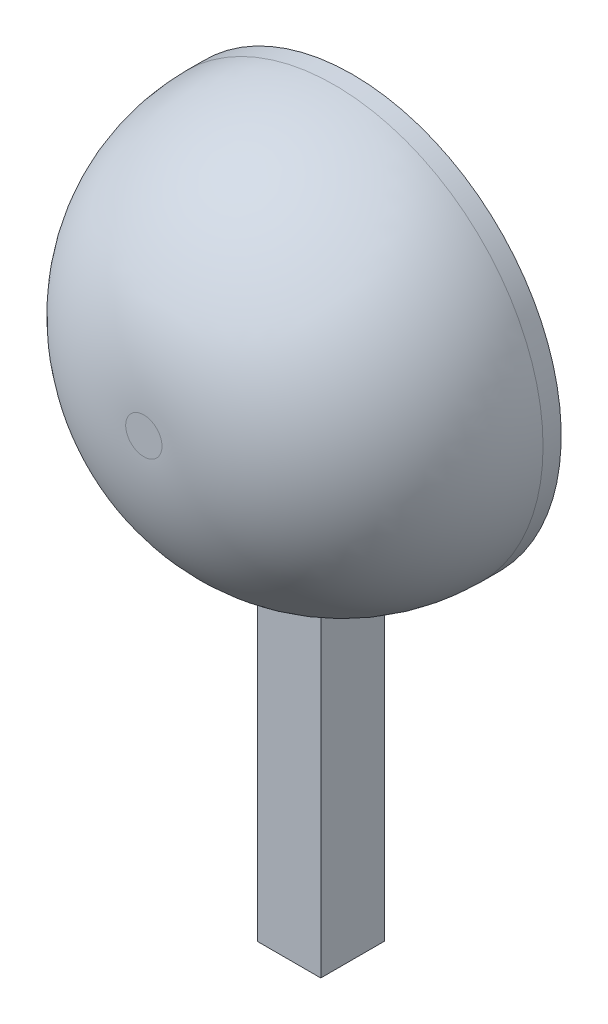
ISO-10303-21;
HEADER;
FILE_DESCRIPTION(('STEP AP214'),'2;1');
FILE_NAME('part.step','',(''),(''),'','','');
FILE_SCHEMA(('AUTOMOTIVE_DESIGN { 1 0 10303 214 1 1 1 1 }'));
ENDSEC;
DATA;
#1=APPLICATION_CONTEXT('core data for automotive mechanical design processes');
#2=APPLICATION_PROTOCOL_DEFINITION('international standard','automotive_design',2000,#1);
#3=PRODUCT_CONTEXT('',#1,'mechanical');
#4=PRODUCT('Part','Part','',(#3));
#5=PRODUCT_RELATED_PRODUCT_CATEGORY('part','',(#4));
#6=PRODUCT_DEFINITION_FORMATION('','',#4);
#7=PRODUCT_DEFINITION_CONTEXT('part definition',#1,'design');
#8=PRODUCT_DEFINITION('design','',#6,#7);
#9=PRODUCT_DEFINITION_SHAPE('','',#8);
#10=(LENGTH_UNIT() NAMED_UNIT(*) SI_UNIT(.MILLI.,.METRE.));
#11=(NAMED_UNIT(*) PLANE_ANGLE_UNIT() SI_UNIT($,.RADIAN.));
#12=(NAMED_UNIT(*) SI_UNIT($,.STERADIAN.) SOLID_ANGLE_UNIT());
#13=UNCERTAINTY_MEASURE_WITH_UNIT(LENGTH_MEASURE(1.E-05),#10,'distance_accuracy_value','');
#14=(GEOMETRIC_REPRESENTATION_CONTEXT(3) GLOBAL_UNCERTAINTY_ASSIGNED_CONTEXT((#13)) GLOBAL_UNIT_ASSIGNED_CONTEXT((#10,
#11,#12)) REPRESENTATION_CONTEXT('',''));
#15=CARTESIAN_POINT('',(0.,0.,0.));
#16=DIRECTION('',(0.,0.,1.));
#17=DIRECTION('',(1.,0.,0.));
#18=AXIS2_PLACEMENT_3D('',#15,#16,#17);
#19=CARTESIAN_POINT('',(0.,23.,23.));
#20=DIRECTION('',(0.,0.,-1.));
#21=DIRECTION('',(-1.,0.,0.));
#22=AXIS2_PLACEMENT_3D('',#19,#20,#21);
#23=CYLINDRICAL_SURFACE('',#22,23.);
#24=DIRECTION('',(0.,0.,-1.));
#25=VECTOR('',#24,1.);
#26=CARTESIAN_POINT('',(-3.5,0.267864156661385,23.));
#27=LINE('',#26,#25);
#28=CARTESIAN_POINT('',(-3.5,0.267864156661384,2.));
#29=VERTEX_POINT('',#28);
#30=CARTESIAN_POINT('',(-3.5,0.267864156661385,0.));
#31=VERTEX_POINT('',#30);
#32=EDGE_CURVE('E113',#29,#31,#27,.T.);
#33=ORIENTED_EDGE('',*,*,#32,.F.);
#34=CARTESIAN_POINT('',(0.,23.,2.));
#35=DIRECTION('',(0.,0.,1.));
#36=DIRECTION('',(1.,0.,0.));
#37=AXIS2_PLACEMENT_3D('',#34,#35,#36);
#38=CIRCLE('',#37,23.);
#39=CARTESIAN_POINT('',(3.5,0.267864156661385,2.));
#40=VERTEX_POINT('',#39);
#41=EDGE_CURVE('E127',#29,#40,#38,.F.);
#42=ORIENTED_EDGE('',*,*,#41,.T.);
#43=DIRECTION('',(0.,0.,-1.));
#44=VECTOR('',#43,1.);
#45=CARTESIAN_POINT('',(3.50000000000001,0.267864156661385,23.));
#46=LINE('',#45,#44);
#47=CARTESIAN_POINT('',(3.5,0.267864156661385,0.));
#48=VERTEX_POINT('',#47);
#49=EDGE_CURVE('E51',#48,#40,#46,.F.);
#50=ORIENTED_EDGE('',*,*,#49,.F.);
#51=CARTESIAN_POINT('',(0.,23.,0.));
#52=DIRECTION('',(0.,0.,1.));
#53=DIRECTION('',(1.,0.,0.));
#54=AXIS2_PLACEMENT_3D('',#51,#52,#53);
#55=CIRCLE('',#54,23.);
#56=EDGE_CURVE('E119',#48,#31,#55,.T.);
#57=ORIENTED_EDGE('',*,*,#56,.T.);
#58=EDGE_LOOP('',(#33,#42,#50,#57));
#59=FACE_BOUND('',#58,.T.);
#60=ADVANCED_FACE('F33',(#59),#23,.T.);
#61=CARTESIAN_POINT('',(0.,23.,2.));
#62=DIRECTION('',(0.,0.,1.));
#63=DIRECTION('',(1.,0.,0.));
#64=AXIS2_PLACEMENT_3D('',#61,#62,#63);
#65=DEGENERATE_TOROIDAL_SURFACE('',#64,2.,21.,.T.);
#66=CARTESIAN_POINT('',(0.,23.,23.));
#67=DIRECTION('',(0.,0.,1.));
#68=DIRECTION('',(1.,0.,0.));
#69=AXIS2_PLACEMENT_3D('',#66,#67,#68);
#70=CIRCLE('',#69,2.);
#71=CARTESIAN_POINT('',(2.,23.,23.));
#72=VERTEX_POINT('',#71);
#73=EDGE_CURVE('E124',#72,#72,#70,.T.);
#74=ORIENTED_EDGE('',*,*,#73,.F.);
#75=EDGE_LOOP('',(#74));
#76=FACE_BOUND('',#75,.T.);
#77=ORIENTED_EDGE('',*,*,#41,.F.);
#78=CARTESIAN_POINT('',(-3.5,0.435962970272571,4.63623327414439));
#79=CARTESIAN_POINT('',(-3.5,0.51009515902552,5.21514480559708));
#80=CARTESIAN_POINT('',(-3.5,0.608666532822807,5.79099986064658));
#81=CARTESIAN_POINT('',(-3.5,0.853992791604416,6.93241489879709));
#82=CARTESIAN_POINT('',(-3.5,1.00075580547213,7.49797312804885));
#83=CARTESIAN_POINT('',(-3.5,1.34149193631945,8.61498121450669));
#84=CARTESIAN_POINT('',(-3.5,1.53548681644944,9.16642443808653));
#85=CARTESIAN_POINT('',(-3.5,1.96925008272972,10.250972472714));
#86=CARTESIAN_POINT('',(-3.5,2.20901652886865,10.7840780598659));
#87=CARTESIAN_POINT('',(-3.5,2.73243934346163,11.8278478411511));
#88=CARTESIAN_POINT('',(-3.5,3.01606621113759,12.3385268252682));
#89=CARTESIAN_POINT('',(-3.5,3.62528044303462,13.334191276005));
#90=CARTESIAN_POINT('',(-3.5,3.95086812975955,13.8191765451067));
#91=CARTESIAN_POINT('',(-3.5,4.641995169444,14.7604445934398));
#92=CARTESIAN_POINT('',(-3.5,5.0075640430758,15.2167057668155));
#93=CARTESIAN_POINT('',(-3.5,5.58359861288709,15.8766912877394));
#94=CARTESIAN_POINT('',(-3.5,5.78023435538795,16.092629088638));
#95=CARTESIAN_POINT('',(-3.5,6.18246510250711,16.5160991577306));
#96=CARTESIAN_POINT('',(-3.5,6.38806236516448,16.7236292817237));
#97=CARTESIAN_POINT('',(-3.5,7.0184194194873,17.3336811683576));
#98=CARTESIAN_POINT('',(-3.5,7.45613009185143,17.7229606454038));
#99=CARTESIAN_POINT('',(-3.5,8.36273733205411,18.4633308291505));
#100=CARTESIAN_POINT('',(-3.5,8.83163406203068,18.8144213372796));
#101=CARTESIAN_POINT('',(-3.5,9.55513756213784,19.3101786015309));
#102=CARTESIAN_POINT('',(-3.5,9.79939061989403,19.470128532998));
#103=CARTESIAN_POINT('',(-3.5,10.2943030416834,19.7796402040271));
#104=CARTESIAN_POINT('',(-3.5,10.5449607481544,19.9292045949144));
#105=CARTESIAN_POINT('',(-3.5,11.3060421323943,20.3620438462923));
#106=CARTESIAN_POINT('',(-3.5,11.8255951589509,20.629479224422));
#107=CARTESIAN_POINT('',(-3.5,12.8872934966715,21.1213742842875));
#108=CARTESIAN_POINT('',(-3.5,13.429527073838,21.3456424102367));
#109=CARTESIAN_POINT('',(-3.5,14.5306560121334,21.7486997451359));
#110=CARTESIAN_POINT('',(-3.5,15.0895497150004,21.9274934635958));
#111=CARTESIAN_POINT('',(-3.5,15.9383945139445,22.1616549248133));
#112=CARTESIAN_POINT('',(-3.5,16.2237365722855,22.2341596687311));
#113=CARTESIAN_POINT('',(-3.5,16.7971061786397,22.3677279296564));
#114=CARTESIAN_POINT('',(-3.5,17.0851337559993,22.4287913214823));
#115=CARTESIAN_POINT('',(-3.5,17.6633138291931,22.5396491317209));
#116=CARTESIAN_POINT('',(-3.5,17.9534661345446,22.5894445478469));
#117=CARTESIAN_POINT('',(-3.5,18.5354126541673,22.6781408356132));
#118=CARTESIAN_POINT('',(-3.5,18.8272068144465,22.7170420633944));
#119=CARTESIAN_POINT('',(-3.5,19.526392020474,22.7977327834983));
#120=CARTESIAN_POINT('',(-3.5,19.9343417037618,22.8346970039423));
#121=CARTESIAN_POINT('',(-3.5,20.7514583616716,22.8914175943757));
#122=CARTESIAN_POINT('',(-3.5,21.1606255582366,22.9111706060693));
#123=CARTESIAN_POINT('',(-3.5,21.7749145042938,22.9309511681712));
#124=CARTESIAN_POINT('',(-3.5,21.9799011743586,22.9359032058681));
#125=CARTESIAN_POINT('',(-3.5,22.3899256987114,22.9429821362361));
#126=CARTESIAN_POINT('',(-3.5,22.5949635532278,22.9451090160722));
#127=CARTESIAN_POINT('',(-3.5,23.0050475672706,22.9467918469989));
#128=CARTESIAN_POINT('',(-3.5,23.2100937267119,22.9463478199028));
#129=CARTESIAN_POINT('',(-3.5,23.6201610802165,22.9428297821148));
#130=CARTESIAN_POINT('',(-3.5,23.8251822743243,22.9397557761764));
#131=CARTESIAN_POINT('',(-3.5,24.4394348031569,22.9261031801291));
#132=CARTESIAN_POINT('',(-3.5,24.8485885393101,22.9110989023394));
#133=CARTESIAN_POINT('',(-3.5,25.66600261822,22.8651494851598));
#134=CARTESIAN_POINT('',(-3.5,26.0742630548041,22.834206109471));
#135=CARTESIAN_POINT('',(-3.5,26.888192036323,22.7531486704243));
#136=CARTESIAN_POINT('',(-3.5,27.2938638749331,22.7030683861835));
#137=CARTESIAN_POINT('',(-3.5,28.1020887098695,22.5819246921558));
#138=CARTESIAN_POINT('',(-3.5,28.5046417772298,22.5108617617263));
#139=CARTESIAN_POINT('',(-3.5,29.1977569431878,22.3688961241609));
#140=CARTESIAN_POINT('',(-3.5,29.4893657320216,22.3030741870304));
#141=CARTESIAN_POINT('',(-3.5,30.0696596092715,22.1595934960685));
#142=CARTESIAN_POINT('',(-3.5,30.358344555019,22.0819341675721));
#143=CARTESIAN_POINT('',(-3.5,31.2195614051492,21.8309930974139));
#144=CARTESIAN_POINT('',(-3.5,31.7869975633115,21.6398007083215));
#145=CARTESIAN_POINT('',(-3.5,32.9027441011977,21.2106109502823));
#146=CARTESIAN_POINT('',(-3.5,33.4510845251103,20.9726914166832));
#147=CARTESIAN_POINT('',(-3.5,34.5254728626207,20.4511855034459));
#148=CARTESIAN_POINT('',(-3.5,35.0515260561216,20.1676100171023));
#149=CARTESIAN_POINT('',(-3.5,36.0782540599296,19.5561385034976));
#150=CARTESIAN_POINT('',(-3.5,36.5788906788053,19.228178344184));
#151=CARTESIAN_POINT('',(-3.5,37.5502412531604,18.5304975503011));
#152=CARTESIAN_POINT('',(-3.5,38.0209525151644,18.1607731649745));
#153=CARTESIAN_POINT('',(-3.5,38.9293789170387,17.3817915224311));
#154=CARTESIAN_POINT('',(-3.5,39.3670557034829,16.9724895350326));
#155=CARTESIAN_POINT('',(-3.5,40.205502810399,16.1177111538936));
#156=CARTESIAN_POINT('',(-3.5,40.6062746210962,15.6722362221873));
#157=CARTESIAN_POINT('',(-3.5,41.3603084885704,14.7576059710843));
#158=CARTESIAN_POINT('',(-3.5,41.7143585955055,14.2891000320202));
#159=CARTESIAN_POINT('',(-3.5,42.3815661491399,13.3238225822362));
#160=CARTESIAN_POINT('',(-3.5,42.6947238733586,12.8270512633743));
#161=CARTESIAN_POINT('',(-3.5,43.277723294889,11.8090674341126));
#162=CARTESIAN_POINT('',(-3.5,43.5475882857767,11.2878682634663));
#163=CARTESIAN_POINT('',(-3.5,44.0422571101286,10.2245073831647));
#164=CARTESIAN_POINT('',(-3.5,44.2670610214483,9.6823457097299));
#165=CARTESIAN_POINT('',(-3.5,44.6692107787452,8.5830568982813));
#166=CARTESIAN_POINT('',(-3.5,44.8467352596142,8.02599510120087));
#167=CARTESIAN_POINT('',(-3.5,45.1541840778211,6.8988880276042));
#168=CARTESIAN_POINT('',(-3.5,45.2841085407629,6.32884278535207));
#169=CARTESIAN_POINT('',(-3.5,45.495445302232,5.17972354564309));
#170=CARTESIAN_POINT('',(-3.5,45.5768488769533,4.60064794376806));
#171=CARTESIAN_POINT('',(-3.5,45.6905237666836,3.43769393238947));
#172=CARTESIAN_POINT('',(-3.5,45.7227950784204,2.85381552256605));
#173=CARTESIAN_POINT('',(-3.5,45.7379661984042,1.68602548213027));
#174=CARTESIAN_POINT('',(-3.5,45.7209173083369,1.10211451734313));
#175=CARTESIAN_POINT('',(-3.5,45.6376806314865,-0.0621940997417455));
#176=CARTESIAN_POINT('',(-3.5,45.571492886656,-0.64259175503858));
#177=CARTESIAN_POINT('',(-3.5,45.3904638270239,-1.7956722280848));
#178=CARTESIAN_POINT('',(-3.5,45.2756287868806,-2.36835603096184));
#179=CARTESIAN_POINT('',(-3.5,44.9981276144014,-3.50201484417126));
#180=CARTESIAN_POINT('',(-3.5,44.8354615123416,-4.06298986191486));
#181=CARTESIAN_POINT('',(-3.5,44.4634838287524,-5.16918180923708));
#182=CARTESIAN_POINT('',(-3.5,44.2541777287756,-5.71440058213161));
#183=CARTESIAN_POINT('',(-3.5,43.7904059025899,-6.78528154172028));
#184=CARTESIAN_POINT('',(-3.5,43.5359400799672,-7.31094368665905));
#185=CARTESIAN_POINT('',(-3.5,42.9836027144443,-8.33910985094838));
#186=CARTESIAN_POINT('',(-3.5,42.6857206959612,-8.84160824265762));
#187=CARTESIAN_POINT('',(-3.5,42.0487315661138,-9.8197524350248));
#188=CARTESIAN_POINT('',(-3.5,41.7096247418365,-10.2953984226473));
#189=CARTESIAN_POINT('',(-3.5,40.9922861122931,-11.2169054049382));
#190=CARTESIAN_POINT('',(-3.5,40.6140190377093,-11.6627389440429));
#191=CARTESIAN_POINT('',(-3.5,39.8213195004331,-12.521021974679));
#192=CARTESIAN_POINT('',(-3.5,39.4068861374137,-12.9334706346311));
#193=CARTESIAN_POINT('',(-3.5,38.5450374437656,-13.721908916612));
#194=CARTESIAN_POINT('',(-3.5,38.0976375643343,-14.0979154299095));
#195=CARTESIAN_POINT('',(-3.5,37.172930952506,-14.8110714181748));
#196=CARTESIAN_POINT('',(-3.5,36.6956265226599,-15.1482238791134));
#197=CARTESIAN_POINT('',(-3.5,35.7129914887369,-15.7824172020324));
#198=CARTESIAN_POINT('',(-3.5,35.2075790303876,-16.0793312183951));
#199=CARTESIAN_POINT('',(-3.5,34.1736135114913,-16.6299634396878));
#200=CARTESIAN_POINT('',(-3.5,33.6450555140606,-16.8836723721102));
#201=CARTESIAN_POINT('',(-3.5,32.5686350523929,-17.3463963613028));
#202=CARTESIAN_POINT('',(-3.5,32.0207690851658,-17.5554032587808));
#203=CARTESIAN_POINT('',(-3.5,30.9100165450643,-17.9276925223123));
#204=CARTESIAN_POINT('',(-3.5,30.3471380301832,-18.0909988979025));
#205=CARTESIAN_POINT('',(-3.5,29.3889492447567,-18.3278934841216));
#206=CARTESIAN_POINT('',(-3.5,28.9965674732718,-18.4135485649007));
#207=CARTESIAN_POINT('',(-3.5,28.2077892812524,-18.5639151946227));
#208=CARTESIAN_POINT('',(-3.5,27.8113927061464,-18.6286259340149));
#209=CARTESIAN_POINT('',(-3.5,27.0153331843647,-18.7381816300541));
#210=CARTESIAN_POINT('',(-3.5,26.6156664588903,-18.782998807284));
#211=CARTESIAN_POINT('',(-3.5,25.8147531169613,-18.8546274724444));
#212=CARTESIAN_POINT('',(-3.5,25.4135064542031,-18.8814384286509));
#213=CARTESIAN_POINT('',(-3.5,24.6089611701765,-18.9205613907335));
#214=CARTESIAN_POINT('',(-3.5,24.2056602483871,-18.9328229968798));
#215=CARTESIAN_POINT('',(-3.5,23.6005818576308,-18.9430814760876));
#216=CARTESIAN_POINT('',(-3.5,23.3988558865405,-18.9451451949074));
#217=CARTESIAN_POINT('',(-3.5,22.9953915285873,-18.9467790433223));
#218=CARTESIAN_POINT('',(-3.5,22.7936531417245,-18.9463491729719));
#219=CARTESIAN_POINT('',(-3.5,22.3903147924258,-18.9429493012676));
#220=CARTESIAN_POINT('',(-3.5,22.1887148176351,-18.9399807751039));
#221=CARTESIAN_POINT('',(-3.5,21.7855734635332,-18.9311813183587));
#222=CARTESIAN_POINT('',(-3.5,21.5840320847807,-18.9253503613244));
#223=CARTESIAN_POINT('',(-3.5,21.181102620856,-18.9103539267881));
#224=CARTESIAN_POINT('',(-3.5,20.9797145161854,-18.9011889878894));
#225=CARTESIAN_POINT('',(-3.5,20.5771522421819,-18.8790327659519));
#226=CARTESIAN_POINT('',(-3.5,20.3759780688266,-18.8660415561804));
#227=CARTESIAN_POINT('',(-3.5,19.8624043922527,-18.8273940473542));
#228=CARTESIAN_POINT('',(-3.5,19.5502239095708,-18.7987099658223));
#229=CARTESIAN_POINT('',(-3.5,18.927125385651,-18.7297793975963));
#230=CARTESIAN_POINT('',(-3.5,18.6162073741641,-18.6895326400055));
#231=CARTESIAN_POINT('',(-3.5,17.9963523913607,-18.5967355778264));
#232=CARTESIAN_POINT('',(-3.5,17.6874145561,-18.5441910760323));
#233=CARTESIAN_POINT('',(-3.5,17.0719549336263,-18.4263421316285));
#234=CARTESIAN_POINT('',(-3.5,16.7654333210392,-18.3610367754025));
#235=CARTESIAN_POINT('',(-3.5,16.1570725299282,-18.2178240865508));
#236=CARTESIAN_POINT('',(-3.5,15.8552170596806,-18.1399861778635));
#237=CARTESIAN_POINT('',(-3.5,15.2551294245627,-17.9713882370435));
#238=CARTESIAN_POINT('',(-3.5,14.9568975585953,-17.8806271466558));
#239=CARTESIAN_POINT('',(-3.5,14.0683722508636,-17.5889039381526));
#240=CARTESIAN_POINT('',(-3.5,13.484325677077,-17.3685198261296));
#241=CARTESIAN_POINT('',(-3.5,12.3349234330008,-16.8756922820981));
#242=CARTESIAN_POINT('',(-3.5,11.7696835421362,-16.6029785034702));
#243=CARTESIAN_POINT('',(-3.5,10.9420130302888,-16.1569542230717));
#244=CARTESIAN_POINT('',(-3.5,10.6694917985008,-16.0021232030834));
#245=CARTESIAN_POINT('',(-3.5,10.1315825973389,-15.6803533613699));
#246=CARTESIAN_POINT('',(-3.5,9.86619679084343,-15.5134109239185));
#247=CARTESIAN_POINT('',(-3.5,9.08018242625639,-14.9939307089469));
#248=CARTESIAN_POINT('',(-3.5,8.57120076329415,-14.6235501059211));
#249=CARTESIAN_POINT('',(-3.5,7.58878209838361,-13.8383339311888));
#250=CARTESIAN_POINT('',(-3.5,7.11534390541359,-13.4234998502001));
#251=CARTESIAN_POINT('',(-3.5,6.44907073677294,-12.7841560154988));
#252=CARTESIAN_POINT('',(-3.5,6.24075590240811,-12.5755841209012));
#253=CARTESIAN_POINT('',(-3.5,5.83322456818062,-12.1498474402753));
#254=CARTESIAN_POINT('',(-3.5,5.63400546751838,-11.9326851441234));
#255=CARTESIAN_POINT('',(-3.5,5.05044621565159,-11.268774315799));
#256=CARTESIAN_POINT('',(-3.5,4.68014207311123,-10.8095422995667));
#257=CARTESIAN_POINT('',(-3.5,3.98031257141463,-9.86186860172485));
#258=CARTESIAN_POINT('',(-3.5,3.6507427139302,-9.37345967427683));
#259=CARTESIAN_POINT('',(-3.5,3.03423753880146,-8.37040970411774));
#260=CARTESIAN_POINT('',(-3.5,2.74730228690407,-7.85576862095565));
#261=CARTESIAN_POINT('',(-3.5,2.21992988903995,-6.80747159714289));
#262=CARTESIAN_POINT('',(-3.5,1.97919725655965,-6.27396423619335));
#263=CARTESIAN_POINT('',(-3.5,1.54360077834603,-5.18851485745663));
#264=CARTESIAN_POINT('',(-3.5,1.34873848080241,-4.63657221817006));
#265=CARTESIAN_POINT('',(-3.5,1.00636496479939,-3.51844533291592));
#266=CARTESIAN_POINT('',(-3.5,0.85883473014447,-2.95226690517626));
#267=CARTESIAN_POINT('',(-3.5,0.612094829485292,-1.80953689643205));
#268=CARTESIAN_POINT('',(-3.5,0.512877056959797,-1.23298707252795));
#269=CARTESIAN_POINT('',(-3.5,0.381657650421081,-0.214991234438425));
#270=CARTESIAN_POINT('',(-3.5,0.339167424648985,0.225134348950868));
#271=CARTESIAN_POINT('',(-3.5,0.282360763847954,1.10730011643345));
#272=CARTESIAN_POINT('',(-3.5,0.268049385000517,1.54934062986811));
#273=CARTESIAN_POINT('',(-3.5,0.267682504491732,2.43342775997329));
#274=CARTESIAN_POINT('',(-3.5,0.281626645780925,2.8754743764961));
#275=CARTESIAN_POINT('',(-3.5,0.337699731105511,3.75767581635032));
#276=CARTESIAN_POINT('',(-3.5,0.379823610557476,4.19783096532081));
#277=CARTESIAN_POINT('',(-3.5,0.435962970272571,4.63623327414439));
#278=B_SPLINE_CURVE_WITH_KNOTS('',3,(#78,#79,#80,#81,#82,#83,#84,#85,#86,#87,#88,#89,#90,#91,
#92,#93,#94,#95,#96,#97,#98,#99,#100,#101,#102,#103,#104,#105,#106,#107,#108,#109,#110,#111,
#112,#113,#114,#115,#116,#117,#118,#119,#120,#121,#122,#123,#124,#125,#126,#127,#128,#129,#130,
#131,#132,#133,#134,#135,#136,#137,#138,#139,#140,#141,#142,#143,#144,#145,#146,#147,#148,#149,
#150,#151,#152,#153,#154,#155,#156,#157,#158,#159,#160,#161,#162,#163,#164,#165,#166,#167,#168,
#169,#170,#171,#172,#173,#174,#175,#176,#177,#178,#179,#180,#181,#182,#183,#184,#185,#186,#187,
#188,#189,#190,#191,#192,#193,#194,#195,#196,#197,#198,#199,#200,#201,#202,#203,#204,#205,#206,
#207,#208,#209,#210,#211,#212,#213,#214,#215,#216,#217,#218,#219,#220,#221,#222,#223,#224,#225,
#226,#227,#228,#229,#230,#231,#232,#233,#234,#235,#236,#237,#238,#239,#240,#241,#242,#243,#244,
#245,#246,#247,#248,#249,#250,#251,#252,#253,#254,#255,#256,#257,#258,#259,#260,#261,#262,#263,
#264,#265,#266,#267,#268,#269,#270,#271,#272,#273,#274,#275,#276,#277),.UNSPECIFIED.,.T.,.F.,(4,
2,2,2,2,2,2,2,2,2,2,2,2,2,2,2,2,2,2,2,2,2,2,2,2,2,2,2,2,2,2,2,2,2,2,2,2,2,2,2,2,2,2,2,2,2,2,2,2,
2,2,2,2,2,2,2,2,2,2,2,2,2,2,2,2,2,2,2,2,2,2,2,2,2,2,2,2,2,2,2,2,2,2,2,2,2,2,2,2,2,2,2,2,2,2,2,2,
2,2,4),(0.,1.75052280316413,3.5013410333309,5.25296752443897,7.00451978996516,8.75489903450795,
10.5052917329758,12.2569856972158,13.1329215429305,14.0090793891827,15.7641887174176,
17.5193071712754,18.3949778218027,19.270424094123,21.0212402173612,22.7796550355758,
24.5378954109811,25.4209320278247,26.3039783055383,27.1869463640413,28.0698855541356,
29.2982887753409,30.5269316321241,31.1420567224261,31.7571846072832,32.3723072729867,
32.9874288269238,34.2154721982172,35.4433797126215,36.6691297492491,37.8948517852615,
38.7914447665362,39.6880812882218,41.4821410400144,43.2732373176009,45.0639068796692,
46.8571919940372,48.6506382878049,50.4461357486024,52.2415606752703,54.0011817547513,
55.760790891801,57.5194500758086,59.2781062212217,61.0300202485956,62.7819296530987,
64.534153946963,66.2863783575232,68.0367808020231,69.787181752101,71.5373569994838,
73.2875311390398,75.037499690759,76.7874719786213,78.5378672059158,80.288250244271,
82.0402236947923,83.7922407715552,85.543441849211,87.2945082555239,89.0509722433704,
90.8078127229264,92.5649735987346,94.321209580027,95.5255404561704,96.7299178771315,
97.9359718431214,99.1420614223269,100.35231687581,100.957516623717,101.562716358417,
102.167564655749,102.772418542845,103.377174759446,103.981919396621,104.922202336339,
105.862507307321,106.802369478846,107.742298964703,108.677190347397,109.612158330657,
111.482329447155,113.36243589687,114.302460097496,115.242766095752,117.128483594608,
119.014137876962,119.898260775756,120.78212926796,122.549609116967,124.315140769401,
126.080675144436,127.834511600081,129.588407241741,131.341597350871,133.094493184489,
134.420158885131,135.7460624307,137.07194922166,138.397597782554),.UNSPECIFIED.);
#279=CARTESIAN_POINT('',(-3.5,0.87909784349913,7.));
#280=VERTEX_POINT('',#279);
#281=EDGE_CURVE('E11',#29,#280,#278,.T.);
#282=ORIENTED_EDGE('',*,*,#281,.T.);
#283=CARTESIAN_POINT('',(0.,23.,7.));
#284=DIRECTION('',(0.,0.,-1.));
#285=DIRECTION('',(-1.,0.,0.));
#286=AXIS2_PLACEMENT_3D('',#283,#284,#285);
#287=CIRCLE('',#286,22.3960780543711);
#288=CARTESIAN_POINT('',(3.5,0.879097843499136,7.));
#289=VERTEX_POINT('',#288);
#290=EDGE_CURVE('E44',#280,#289,#287,.F.);
#291=ORIENTED_EDGE('',*,*,#290,.T.);
#292=CARTESIAN_POINT('',(3.5,0.435962970272572,4.63623327414439));
#293=CARTESIAN_POINT('',(3.5,0.361918471960446,4.05795940741611));
#294=CARTESIAN_POINT('',(3.5,0.312248693430518,3.47651297029716));
#295=CARTESIAN_POINT('',(3.5,0.274569912557137,2.60283981259863));
#296=CARTESIAN_POINT('',(3.5,0.268150769896195,2.31129662673705));
#297=CARTESIAN_POINT('',(3.5,0.267596259562973,1.72812224668483));
#298=CARTESIAN_POINT('',(3.5,0.273464014412255,1.43649104895919));
#299=CARTESIAN_POINT('',(3.5,0.309536631129526,0.561570579408912));
#300=CARTESIAN_POINT('',(3.5,0.358240649030493,-0.0210535033718715));
#301=CARTESIAN_POINT('',(3.5,0.504618730017433,-1.18011789383028));
#302=CARTESIAN_POINT('',(3.5,0.602292854695937,-1.75655819372928));
#303=CARTESIAN_POINT('',(3.5,0.784926067760744,-2.61325911972746));
#304=CARTESIAN_POINT('',(3.5,0.851815645307011,-2.8974714728533));
#305=CARTESIAN_POINT('',(3.5,0.997498018344323,-3.46274935548943));
#306=CARTESIAN_POINT('',(3.5,1.07628775334701,-3.74381567419308));
#307=CARTESIAN_POINT('',(3.5,1.33035727731761,-4.58171573226426));
#308=CARTESIAN_POINT('',(3.5,1.52334620270266,-5.13329190848828));
#309=CARTESIAN_POINT('',(3.5,1.95493206108784,-6.2177846116659));
#310=CARTESIAN_POINT('',(3.5,2.19349795382251,-6.75071354776083));
#311=CARTESIAN_POINT('',(3.5,2.71463934468409,-7.79462040544076));
#312=CARTESIAN_POINT('',(3.5,2.99721466845291,-8.30559841398149));
#313=CARTESIAN_POINT('',(3.5,3.60438900910604,-9.30203233858618));
#314=CARTESIAN_POINT('',(3.5,3.92899366460841,-9.78748481785802));
#315=CARTESIAN_POINT('',(3.5,4.61787414496249,-10.7293712980465));
#316=CARTESIAN_POINT('',(3.5,4.98214975035931,-11.1858054594669));
#317=CARTESIAN_POINT('',(3.5,5.74820047067139,-12.0669469824928));
#318=CARTESIAN_POINT('',(3.5,6.1500175909636,-12.4916178241767));
#319=CARTESIAN_POINT('',(3.5,6.98792854028884,-13.3056976398588));
#320=CARTESIAN_POINT('',(3.5,7.42402324906649,-13.6951057082749));
#321=CARTESIAN_POINT('',(3.5,8.32869474818452,-14.4370525951321));
#322=CARTESIAN_POINT('',(3.5,8.79736422106713,-14.7894784015857));
#323=CARTESIAN_POINT('',(3.5,9.76260444992709,-15.4536991057184));
#324=CARTESIAN_POINT('',(3.5,10.2591731501585,-15.7654969914484));
#325=CARTESIAN_POINT('',(3.5,11.2749689492865,-16.3454745315984));
#326=CARTESIAN_POINT('',(3.49999999999999,11.7941152322261,-16.613795748559));
#327=CARTESIAN_POINT('',(3.49999999999999,12.85295117354,-17.1064981379611));
#328=CARTESIAN_POINT('',(3.49999999999999,13.3926449058274,-17.3308705419758));
#329=CARTESIAN_POINT('',(3.49999999999999,14.4919672579265,-17.7357276185147));
#330=CARTESIAN_POINT('',(3.49999999999999,15.0516955812336,-17.9159425350252));
#331=CARTESIAN_POINT('',(3.49999999999999,15.9005411612437,-18.1517150530973));
#332=CARTESIAN_POINT('',(3.49999999999999,16.1849808601181,-18.2245377784593));
#333=CARTESIAN_POINT('',(3.49999999999999,16.7565534181271,-18.3587972733456));
#334=CARTESIAN_POINT('',(3.49999999999999,17.043686294155,-18.4202339713992));
#335=CARTESIAN_POINT('',(3.49999999999999,17.6219222852811,-18.5322433148834));
#336=CARTESIAN_POINT('',(3.49999999999999,17.9130390060602,-18.5827454177457));
#337=CARTESIAN_POINT('',(3.49999999999999,18.4969562319319,-18.672749121367));
#338=CARTESIAN_POINT('',(3.49999999999999,18.7897567026014,-18.7122509462088));
#339=CARTESIAN_POINT('',(3.49999999999999,19.3768189543049,-18.7808849125794));
#340=CARTESIAN_POINT('',(3.49999999999999,19.671081782654,-18.8100080289312));
#341=CARTESIAN_POINT('',(3.49999999999999,20.2603830043672,-18.858771916496));
#342=CARTESIAN_POINT('',(3.49999999999999,20.5554214144289,-18.8784124818481));
#343=CARTESIAN_POINT('',(3.49999999999999,21.3043591447072,-18.9179645466965));
#344=CARTESIAN_POINT('',(3.49999999999999,21.7585465686466,-18.9323656812777));
#345=CARTESIAN_POINT('',(3.49999999999999,22.4399875515867,-18.9436911216008));
#346=CARTESIAN_POINT('',(3.49999999999999,22.6671903925499,-18.9457531625048));
#347=CARTESIAN_POINT('',(3.49999999999999,23.1216069131626,-18.9467387315837));
#348=CARTESIAN_POINT('',(3.49999999999999,23.3488205927493,-18.9456622761178));
#349=CARTESIAN_POINT('',(3.49999999999999,23.8032263727933,-18.9402079858886));
#350=CARTESIAN_POINT('',(3.49999999999999,24.0304184702074,-18.9358298949286));
#351=CARTESIAN_POINT('',(3.49999999999999,24.4846949041081,-18.9232103958839));
#352=CARTESIAN_POINT('',(3.49999999999999,24.7117792427045,-18.914969066855));
#353=CARTESIAN_POINT('',(3.49999999999999,25.1656922225696,-18.8939128265504));
#354=CARTESIAN_POINT('',(3.49999999999999,25.392520907962,-18.8810988887457));
#355=CARTESIAN_POINT('',(3.49999999999999,25.8458247987568,-18.8502302707572));
#356=CARTESIAN_POINT('',(3.49999999999999,26.0723000055257,-18.8321756108829));
#357=CARTESIAN_POINT('',(3.49999999999999,26.5235214858889,-18.7903987694611));
#358=CARTESIAN_POINT('',(3.49999999999999,26.7482705578416,-18.7667071616604));
#359=CARTESIAN_POINT('',(3.49999999999999,27.1970420481684,-18.7132206627573));
#360=CARTESIAN_POINT('',(3.49999999999999,27.4210644486041,-18.6834256221343));
#361=CARTESIAN_POINT('',(3.49999999999999,28.0917738121784,-18.584438993738));
#362=CARTESIAN_POINT('',(3.49999999999999,28.5370933728705,-18.5056467564306));
#363=CARTESIAN_POINT('',(3.49999999999999,29.4216231128742,-18.3213479644739));
#364=CARTESIAN_POINT('',(3.49999999999999,29.8608398937363,-18.2158731091492));
#365=CARTESIAN_POINT('',(3.49999999999999,30.7317919682415,-17.9778178367743));
#366=CARTESIAN_POINT('',(3.49999999999999,31.1635283641704,-17.8452414508091));
#367=CARTESIAN_POINT('',(3.49999999999999,32.1485454647455,-17.5082892198249));
#368=CARTESIAN_POINT('',(3.49999999999999,32.6985900260473,-17.2943568351352));
#369=CARTESIAN_POINT('',(3.49999999999999,33.7789602280992,-16.8212228556132));
#370=CARTESIAN_POINT('',(3.49999999999999,34.3092818422705,-16.5620120777467));
#371=CARTESIAN_POINT('',(3.49999999999999,35.3468919451328,-15.9995300074955));
#372=CARTESIAN_POINT('',(3.5,35.854151020079,-15.6962044122201));
#373=CARTESIAN_POINT('',(3.5,36.8411374635614,-15.047772804584));
#374=CARTESIAN_POINT('',(3.5,37.3208681306822,-14.7026718134239));
#375=CARTESIAN_POINT('',(3.5,38.24936778903,-13.9730221503847));
#376=CARTESIAN_POINT('',(3.5,38.6981354043701,-13.5884717274005));
#377=CARTESIAN_POINT('',(3.5,39.5614159188922,-12.7826263167691));
#378=CARTESIAN_POINT('',(3.5,39.9759270115713,-12.3613293937162));
#379=CARTESIAN_POINT('',(3.5,40.7675208274621,-11.4851362712622));
#380=CARTESIAN_POINT('',(3.5,41.1446136980206,-11.0302492397578));
#381=CARTESIAN_POINT('',(3.5,41.8587283459139,-10.0900547811922));
#382=CARTESIAN_POINT('',(3.5,42.1957511054565,-9.60474810023009));
#383=CARTESIAN_POINT('',(3.5,42.8245631680373,-8.61148161597339));
#384=CARTESIAN_POINT('',(3.5,43.1167148053873,-8.10375115083598));
#385=CARTESIAN_POINT('',(3.5,43.6571119245377,-7.06543676962803));
#386=CARTESIAN_POINT('',(3.5,43.9053574012068,-6.53485285088661));
#387=CARTESIAN_POINT('',(3.5,44.3561534627614,-5.45461854948945));
#388=CARTESIAN_POINT('',(3.5,44.5587042280005,-4.90496824209721));
#389=CARTESIAN_POINT('',(3.5,44.9166544745975,-3.79052348235933));
#390=CARTESIAN_POINT('',(3.5,45.072054049611,-3.22572906009659));
#391=CARTESIAN_POINT('',(3.5,45.3342703735856,-2.08639477635453));
#392=CARTESIAN_POINT('',(3.5,45.4412022819489,-1.51188141549655));
#393=CARTESIAN_POINT('',(3.5,45.6062618645247,-0.35588652951559));
#394=CARTESIAN_POINT('',(3.5,45.66438961092,0.225594985299979));
#395=CARTESIAN_POINT('',(3.5,45.7314272378372,1.391431794701));
#396=CARTESIAN_POINT('',(3.5,45.7403334400408,1.97578730079343));
#397=CARTESIAN_POINT('',(3.5,45.708854349243,3.14316933044812));
#398=CARTESIAN_POINT('',(3.5,45.6684690460435,3.72619585373538));
#399=CARTESIAN_POINT('',(3.5,45.5387268415522,4.88649525547571));
#400=CARTESIAN_POINT('',(3.5,45.4493930693714,5.46377072034615));
#401=CARTESIAN_POINT('',(3.5,45.2224089299376,6.60874249648743));
#402=CARTESIAN_POINT('',(3.5,45.0847586071937,7.17643881658205));
#403=CARTESIAN_POINT('',(3.5,44.7621745556998,8.29804978136236));
#404=CARTESIAN_POINT('',(3.5,44.5772550510231,8.85196851702397));
#405=CARTESIAN_POINT('',(3.5,44.161436188598,9.9422688524422));
#406=CARTESIAN_POINT('',(3.5,43.9305368006629,10.4786504406851));
#407=CARTESIAN_POINT('',(3.5,43.4244359313452,11.5300140464432));
#408=CARTESIAN_POINT('',(3.5,43.1492398546845,12.0449986650107));
#409=CARTESIAN_POINT('',(3.5,42.5565122851731,13.0499724292326));
#410=CARTESIAN_POINT('',(3.5,42.2389809251717,13.5399616533166));
#411=CARTESIAN_POINT('',(3.5,41.5634601716513,14.4920196716117));
#412=CARTESIAN_POINT('',(3.5,41.2054318678113,14.9540609474862));
#413=CARTESIAN_POINT('',(3.5,40.6403216889174,15.6231775241387));
#414=CARTESIAN_POINT('',(3.5,40.447262591589,15.8422365766879));
#415=CARTESIAN_POINT('',(3.5,40.052051708007,16.272097835298));
#416=CARTESIAN_POINT('',(3.50000000000001,39.8498976267579,16.4828979319334));
#417=CARTESIAN_POINT('',(3.50000000000001,39.229570224782,17.1030847329126));
#418=CARTESIAN_POINT('',(3.50000000000001,38.7982264379293,17.4994355263048));
#419=CARTESIAN_POINT('',(3.50000000000001,37.9037246821507,18.2544443845742));
#420=CARTESIAN_POINT('',(3.50000000000001,37.4405665631282,18.6131022716002));
#421=CARTESIAN_POINT('',(3.50000000000001,36.7252335148916,19.1204726590952));
#422=CARTESIAN_POINT('',(3.50000000000001,36.4836665740473,19.284310407739));
#423=CARTESIAN_POINT('',(3.50000000000001,35.9939584469689,19.6017016226973));
#424=CARTESIAN_POINT('',(3.50000000000001,35.7458189605292,19.7552577125072));
#425=CARTESIAN_POINT('',(3.50000000000001,34.992022110037,20.2002246140593));
#426=CARTESIAN_POINT('',(3.50000000000001,34.4769772729479,20.4759404960782));
#427=CARTESIAN_POINT('',(3.50000000000001,33.4239947952971,20.9845319603571));
#428=CARTESIAN_POINT('',(3.50000000000001,32.8859820261301,21.2172511692413));
#429=CARTESIAN_POINT('',(3.50000000000001,31.7925899208461,21.6374551306376));
#430=CARTESIAN_POINT('',(3.50000000000001,31.2372133086,21.8249469381652));
#431=CARTESIAN_POINT('',(3.50000000000001,30.3927550991403,22.0723269300478));
#432=CARTESIAN_POINT('',(3.50000000000001,30.1085631531224,22.1493105861278));
#433=CARTESIAN_POINT('',(3.50000000000001,29.537289874743,22.2917944295841));
#434=CARTESIAN_POINT('',(3.50000000000001,29.250208471849,22.3572943359164));
#435=CARTESIAN_POINT('',(3.50000000000001,28.6736932206755,22.4769399384866));
#436=CARTESIAN_POINT('',(3.50000000000001,28.384259324371,22.5310854023212));
#437=CARTESIAN_POINT('',(3.50000000000001,27.8035596806011,22.6283057685931));
#438=CARTESIAN_POINT('',(3.50000000000001,27.5122940532504,22.6713813893316));
#439=CARTESIAN_POINT('',(3.50000000000001,26.9801635265178,22.7402688146092));
#440=CARTESIAN_POINT('',(3.50000000000001,26.7395167716024,22.7677873303825));
#441=CARTESIAN_POINT('',(3.50000000000001,26.2575438174051,22.8161095112056));
#442=CARTESIAN_POINT('',(3.50000000000001,26.0162175929538,22.8369129241168));
#443=CARTESIAN_POINT('',(3.50000000000001,25.5330396650774,22.8724127542256));
#444=CARTESIAN_POINT('',(3.50000000000001,25.2911878097078,22.8871070726246));
#445=CARTESIAN_POINT('',(3.50000000000001,24.8072252117316,22.9111618556307));
#446=CARTESIAN_POINT('',(3.50000000000001,24.5651144691552,22.9205223208615));
#447=CARTESIAN_POINT('',(3.50000000000001,24.0803248418102,22.934791404209));
#448=CARTESIAN_POINT('',(3.50000000000001,23.8376457264867,22.9396918675992));
#449=CARTESIAN_POINT('',(3.50000000000001,23.3522411528421,22.9457167381498));
#450=CARTESIAN_POINT('',(3.50000000000001,23.1095156941459,22.9468411133462));
#451=CARTESIAN_POINT('',(3.50000000000001,22.6240922692358,22.9455158492488));
#452=CARTESIAN_POINT('',(3.50000000000001,22.3813943023298,22.9430664798324));
#453=CARTESIAN_POINT('',(3.50000000000001,21.896070075995,22.9341762062717));
#454=CARTESIAN_POINT('',(3.50000000000001,21.6534438159334,22.9277353384578));
#455=CARTESIAN_POINT('',(3.50000000000001,21.1690391092848,22.9100806175753));
#456=CARTESIAN_POINT('',(3.50000000000001,20.9272601905425,22.8988801749609));
#457=CARTESIAN_POINT('',(3.50000000000001,20.4440246082947,22.8708538581624));
#458=CARTESIAN_POINT('',(3.50000000000001,20.2025679425423,22.8540280234061));
#459=CARTESIAN_POINT('',(3.50000000000001,19.720205313277,22.814031954954));
#460=CARTESIAN_POINT('',(3.50000000000001,19.4792992798689,22.7908625774152));
#461=CARTESIAN_POINT('',(3.50000000000001,18.9982469630277,22.7376485740819));
#462=CARTESIAN_POINT('',(3.50000000000001,18.7581006968731,22.70760379305));
#463=CARTESIAN_POINT('',(3.50000000000001,18.040507618922,22.6067463879016));
#464=CARTESIAN_POINT('',(3.50000000000001,17.5645256838827,22.5251012603535));
#465=CARTESIAN_POINT('',(3.50000000000001,16.618813201902,22.3312525093915));
#466=CARTESIAN_POINT('',(3.50000000000001,16.1490824208153,22.219050033941));
#467=CARTESIAN_POINT('',(3.50000000000001,15.3977788335506,22.0129309500081));
#468=CARTESIAN_POINT('',(3.50000000000001,15.1135317885293,21.9286606845784));
#469=CARTESIAN_POINT('',(3.50000000000001,14.5488080422516,21.7484583481703));
#470=CARTESIAN_POINT('',(3.50000000000001,14.2683308565178,21.6525277919216));
#471=CARTESIAN_POINT('',(3.50000000000001,13.4327995410394,21.347133545602));
#472=CARTESIAN_POINT('',(3.50000000000001,12.8840204385161,21.1201698195305));
#473=CARTESIAN_POINT('',(3.50000000000001,11.8084374257514,20.6212128385231));
#474=CARTESIAN_POINT('',(3.50000000000001,11.2816007742551,20.3492899204613));
#475=CARTESIAN_POINT('',(3.50000000000001,10.252964814757,19.761923367199));
#476=CARTESIAN_POINT('',(3.50000000000001,9.75115768020251,19.4464934539728));
#477=CARTESIAN_POINT('',(3.50000000000001,8.77568504378503,18.773865224581));
#478=CARTESIAN_POINT('',(3.50000000000001,8.30204552408932,18.4166292203022));
#479=CARTESIAN_POINT('',(3.50000000000001,7.38686021401144,17.6630934608593));
#480=CARTESIAN_POINT('',(3.50000000000001,6.94531830996183,17.2667889889836));
#481=CARTESIAN_POINT('',(3.50000000000001,6.09708107736362,16.4373993307742));
#482=CARTESIAN_POINT('',(3.5,5.69042850956749,16.0042702699421));
#483=CARTESIAN_POINT('',(3.5,5.10946231177249,15.3298672530478));
#484=CARTESIAN_POINT('',(3.5,4.92063953783033,15.1009441106694));
#485=CARTESIAN_POINT('',(3.5,4.55290881386281,14.6351692982136));
#486=CARTESIAN_POINT('',(3.5,4.3740034439357,14.3983155903999));
#487=CARTESIAN_POINT('',(3.5,3.85695673354882,13.6824065199956));
#488=CARTESIAN_POINT('',(3.5,3.53372149618986,13.1924670001886));
#489=CARTESIAN_POINT('',(3.5,2.92985452129208,12.1870037816844));
#490=CARTESIAN_POINT('',(3.5,2.64922246485878,11.6714802745276));
#491=CARTESIAN_POINT('',(3.5,2.26200029678597,10.8823516598021));
#492=CARTESIAN_POINT('',(3.5,2.13862679100843,10.6168723479816));
#493=CARTESIAN_POINT('',(3.5,1.90323774122138,10.0810082019457));
#494=CARTESIAN_POINT('',(3.5,1.79121932010301,9.8106246309259));
#495=CARTESIAN_POINT('',(3.5,1.47252722781615,8.99288426127621));
#496=CARTESIAN_POINT('',(3.5,1.28309432989541,8.43868828887626));
#497=CARTESIAN_POINT('',(3.5,0.960933691230339,7.34752491398095));
#498=CARTESIAN_POINT('',(3.5,0.825642218853351,6.81130850728594));
#499=CARTESIAN_POINT('',(3.5,0.59825146571793,5.72975656974493));
#500=CARTESIAN_POINT('',(3.5,0.506155046731665,5.18442043717417));
#501=CARTESIAN_POINT('',(3.5,0.435962970272572,4.63623327414439));
#502=B_SPLINE_CURVE_WITH_KNOTS('',3,(#292,#293,#294,#295,#296,#297,#298,#299,#300,#301,#302,
#303,#304,#305,#306,#307,#308,#309,#310,#311,#312,#313,#314,#315,#316,#317,#318,#319,#320,#321,
#322,#323,#324,#325,#326,#327,#328,#329,#330,#331,#332,#333,#334,#335,#336,#337,#338,#339,#340,
#341,#342,#343,#344,#345,#346,#347,#348,#349,#350,#351,#352,#353,#354,#355,#356,#357,#358,#359,
#360,#361,#362,#363,#364,#365,#366,#367,#368,#369,#370,#371,#372,#373,#374,#375,#376,#377,#378,
#379,#380,#381,#382,#383,#384,#385,#386,#387,#388,#389,#390,#391,#392,#393,#394,#395,#396,#397,
#398,#399,#400,#401,#402,#403,#404,#405,#406,#407,#408,#409,#410,#411,#412,#413,#414,#415,#416,
#417,#418,#419,#420,#421,#422,#423,#424,#425,#426,#427,#428,#429,#430,#431,#432,#433,#434,#435,
#436,#437,#438,#439,#440,#441,#442,#443,#444,#445,#446,#447,#448,#449,#450,#451,#452,#453,#454,
#455,#456,#457,#458,#459,#460,#461,#462,#463,#464,#465,#466,#467,#468,#469,#470,#471,#472,#473,
#474,#475,#476,#477,#478,#479,#480,#481,#482,#483,#484,#485,#486,#487,#488,#489,#490,#491,#492,
#493,#494,#495,#496,#497,#498,#499,#500,#501),.UNSPECIFIED.,.T.,.F.,(4,2,2,2,2,2,2,2,2,2,2,2,2,
2,2,2,2,2,2,2,2,2,2,2,2,2,2,2,2,2,2,2,2,2,2,2,2,2,2,2,2,2,2,2,2,2,2,2,2,2,2,2,2,2,2,2,2,2,2,2,2,
2,2,2,2,2,2,2,2,2,2,2,2,2,2,2,2,2,2,2,2,2,2,2,2,2,2,2,2,2,2,2,2,2,2,2,2,2,2,2,2,2,2,2,4),(0.,
1.74842426305393,2.62304472982584,3.49788749459533,5.24964438630309,7.00140348130212,
7.87710783370179,8.7525873543086,10.5034200080235,12.2530644779763,14.0027020163026,
15.7525745281449,17.5024373603961,19.2542821215945,21.0061718591065,22.763268079648,
24.5202349984672,26.2713608886083,28.0228357987406,29.7847575890792,30.6654077262932,
31.5460633912113,32.4322415016318,33.3184015586923,34.2053303383319,35.0922783718469,
36.4551820054155,37.1368090206932,37.8184324830452,38.5001088426812,39.1817712533373,
39.8632886301171,40.5448033658254,41.2227027319809,41.9006187071641,43.2564794257983,
44.6107368659027,45.9647930199631,47.7332153402617,49.5019967364141,51.2729741271901,
53.0437388660086,54.8145822406454,56.5855189404323,58.3559740645671,60.1263857819407,
61.8816503655843,63.636915154367,65.3921730151302,67.1474273894337,68.8984891234291,
70.6495482675441,72.4007382662675,74.151928627305,75.9022922292715,77.6526542188098,
79.4024901144482,81.1523271588897,82.9019508640462,84.6515690789577,86.402882877504,
87.2786335226985,88.154606404869,89.9097713699823,91.6649446163418,92.5403780744356,
93.415587296575,95.1659724488105,96.9226033327478,98.6789600226466,99.5620679587675,
100.445197504332,101.328345124061,102.211435423533,102.937984310313,103.664560474353,
104.391386050023,105.118211540691,105.846363314412,106.574521251831,107.302624204031,
108.030720529161,108.756778850888,109.482832083856,110.208787373231,110.934759055306,
112.382553527487,113.830293617144,114.7194822229,115.608555441842,117.387863932722,
119.164414657921,120.94040634025,122.718011591484,124.495831715322,126.2758005232,
127.165813693392,128.056057331878,129.814707362504,131.573344228586,132.451352497548,
133.32913774105,135.083877142715,136.741223781413,138.398680207654),.UNSPECIFIED.);
#503=EDGE_CURVE('E136',#289,#40,#502,.T.);
#504=ORIENTED_EDGE('',*,*,#503,.T.);
#505=EDGE_LOOP('',(#77,#282,#291,#504));
#506=FACE_BOUND('',#505,.T.);
#507=ADVANCED_FACE('F140',(#76,#506),#65,.T.);
#508=CARTESIAN_POINT('',(0.,23.,1.));
#509=DIRECTION('',(0.,0.,1.));
#510=DIRECTION('',(1.,0.,0.));
#511=AXIS2_PLACEMENT_3D('',#508,#509,#510);
#512=TOROIDAL_SURFACE('',#511,20.,1.);
#513=CARTESIAN_POINT('',(0.,23.,1.));
#514=DIRECTION('',(0.,0.,1.));
#515=DIRECTION('',(1.,0.,0.));
#516=AXIS2_PLACEMENT_3D('',#513,#514,#515);
#517=CIRCLE('',#516,19.);
#518=CARTESIAN_POINT('',(19.,23.,1.));
#519=VERTEX_POINT('',#518);
#520=EDGE_CURVE('E130',#519,#519,#517,.F.);
#521=ORIENTED_EDGE('',*,*,#520,.F.);
#522=EDGE_LOOP('',(#521));
#523=FACE_BOUND('',#522,.T.);
#524=CARTESIAN_POINT('',(0.,23.,0.));
#525=DIRECTION('',(0.,0.,1.));
#526=DIRECTION('',(1.,0.,0.));
#527=AXIS2_PLACEMENT_3D('',#524,#525,#526);
#528=CIRCLE('',#527,20.);
#529=CARTESIAN_POINT('',(20.,23.,0.));
#530=VERTEX_POINT('',#529);
#531=EDGE_CURVE('E133',#530,#530,#528,.T.);
#532=ORIENTED_EDGE('',*,*,#531,.F.);
#533=EDGE_LOOP('',(#532));
#534=FACE_BOUND('',#533,.T.);
#535=ADVANCED_FACE('F35',(#523,#534),#512,.T.);
#536=CARTESIAN_POINT('',(0.,23.,23.));
#537=DIRECTION('',(0.,0.,1.));
#538=DIRECTION('',(1.,0.,0.));
#539=AXIS2_PLACEMENT_3D('',#536,#537,#538);
#540=PLANE('',#539);
#541=ORIENTED_EDGE('',*,*,#73,.T.);
#542=EDGE_LOOP('',(#541));
#543=FACE_BOUND('',#542,.T.);
#544=ADVANCED_FACE('F165',(#543),#540,.T.);
#545=CARTESIAN_POINT('',(0.,23.,0.));
#546=DIRECTION('',(0.,0.,1.));
#547=DIRECTION('',(1.,0.,0.));
#548=AXIS2_PLACEMENT_3D('',#545,#546,#547);
#549=PLANE('',#548);
#550=ORIENTED_EDGE('',*,*,#56,.F.);
#551=DIRECTION('',(0.,-1.,0.));
#552=VECTOR('',#551,1.);
#553=CARTESIAN_POINT('',(3.5,3.,0.));
#554=LINE('',#553,#552);
#555=CARTESIAN_POINT('',(3.5,-35.,0.));
#556=VERTEX_POINT('',#555);
#557=EDGE_CURVE('E109',#48,#556,#554,.T.);
#558=ORIENTED_EDGE('',*,*,#557,.T.);
#559=DIRECTION('',(-1.,0.,0.));
#560=VECTOR('',#559,1.);
#561=CARTESIAN_POINT('',(-3.5,-35.,0.));
#562=LINE('',#561,#560);
#563=CARTESIAN_POINT('',(-3.5,-35.,0.));
#564=VERTEX_POINT('',#563);
#565=EDGE_CURVE('E106',#556,#564,#562,.T.);
#566=ORIENTED_EDGE('',*,*,#565,.T.);
#567=DIRECTION('',(0.,-1.,0.));
#568=VECTOR('',#567,1.);
#569=CARTESIAN_POINT('',(-3.5,3.,0.));
#570=LINE('',#569,#568);
#571=EDGE_CURVE('E102',#31,#564,#570,.T.);
#572=ORIENTED_EDGE('',*,*,#571,.F.);
#573=EDGE_LOOP('',(#550,#558,#566,#572));
#574=FACE_BOUND('',#573,.T.);
#575=ORIENTED_EDGE('',*,*,#531,.T.);
#576=EDGE_LOOP('',(#575));
#577=FACE_BOUND('',#576,.T.);
#578=ADVANCED_FACE('F157',(#574,#577),#549,.F.);
#579=CARTESIAN_POINT('',(0.,23.,23.));
#580=DIRECTION('',(0.,0.,-1.));
#581=DIRECTION('',(-1.,0.,0.));
#582=AXIS2_PLACEMENT_3D('',#579,#580,#581);
#583=CYLINDRICAL_SURFACE('',#582,19.);
#584=ORIENTED_EDGE('',*,*,#520,.T.);
#585=EDGE_LOOP('',(#584));
#586=FACE_BOUND('',#585,.T.);
#587=CARTESIAN_POINT('',(0.,23.,2.));
#588=DIRECTION('',(0.,0.,-1.));
#589=DIRECTION('',(-1.,0.,0.));
#590=AXIS2_PLACEMENT_3D('',#587,#588,#589);
#591=CIRCLE('',#590,19.);
#592=CARTESIAN_POINT('',(-19.,23.,2.));
#593=VERTEX_POINT('',#592);
#594=EDGE_CURVE('E116',#593,#593,#591,.T.);
#595=ORIENTED_EDGE('',*,*,#594,.F.);
#596=EDGE_LOOP('',(#595));
#597=FACE_BOUND('',#596,.T.);
#598=ADVANCED_FACE('F153',(#586,#597),#583,.F.);
#599=CARTESIAN_POINT('',(0.,23.,19.));
#600=DIRECTION('',(0.,0.,1.));
#601=DIRECTION('',(1.,0.,0.));
#602=AXIS2_PLACEMENT_3D('',#599,#600,#601);
#603=PLANE('',#602);
#604=CARTESIAN_POINT('',(0.,23.,19.));
#605=DIRECTION('',(0.,0.,1.));
#606=DIRECTION('',(1.,0.,0.));
#607=AXIS2_PLACEMENT_3D('',#604,#605,#606);
#608=CIRCLE('',#607,2.);
#609=CARTESIAN_POINT('',(2.,23.,19.));
#610=VERTEX_POINT('',#609);
#611=EDGE_CURVE('E115',#610,#610,#608,.T.);
#612=ORIENTED_EDGE('',*,*,#611,.F.);
#613=EDGE_LOOP('',(#612));
#614=FACE_BOUND('',#613,.T.);
#615=ADVANCED_FACE('F156',(#614),#603,.F.);
#616=CARTESIAN_POINT('',(0.,23.,2.));
#617=DIRECTION('',(0.,0.,1.));
#618=DIRECTION('',(1.,0.,0.));
#619=AXIS2_PLACEMENT_3D('',#616,#617,#618);
#620=DEGENERATE_TOROIDAL_SURFACE('',#619,2.,17.,.T.);
#621=ORIENTED_EDGE('',*,*,#594,.T.);
#622=EDGE_LOOP('',(#621));
#623=FACE_BOUND('',#622,.T.);
#624=ORIENTED_EDGE('',*,*,#611,.T.);
#625=EDGE_LOOP('',(#624));
#626=FACE_BOUND('',#625,.T.);
#627=ADVANCED_FACE('F152',(#623,#626),#620,.F.);
#628=CARTESIAN_POINT('',(-3.5,3.,0.));
#629=DIRECTION('',(1.,0.,0.));
#630=DIRECTION('',(0.,0.,-1.));
#631=AXIS2_PLACEMENT_3D('',#628,#629,#630);
#632=PLANE('',#631);
#633=ORIENTED_EDGE('',*,*,#281,.F.);
#634=ORIENTED_EDGE('',*,*,#32,.T.);
#635=ORIENTED_EDGE('',*,*,#571,.T.);
#636=DIRECTION('',(0.,0.,1.));
#637=VECTOR('',#636,1.);
#638=CARTESIAN_POINT('',(-3.5,-35.,0.));
#639=LINE('',#638,#637);
#640=CARTESIAN_POINT('',(-3.5,-35.,7.));
#641=VERTEX_POINT('',#640);
#642=EDGE_CURVE('E95',#564,#641,#639,.T.);
#643=ORIENTED_EDGE('',*,*,#642,.T.);
#644=DIRECTION('',(0.,-1.,0.));
#645=VECTOR('',#644,1.);
#646=CARTESIAN_POINT('',(-3.5,3.,7.));
#647=LINE('',#646,#645);
#648=EDGE_CURVE('E81',#280,#641,#647,.T.);
#649=ORIENTED_EDGE('',*,*,#648,.F.);
#650=EDGE_LOOP('',(#633,#634,#635,#643,#649));
#651=FACE_BOUND('',#650,.T.);
#652=ADVANCED_FACE('F100',(#651),#632,.F.);
#653=CARTESIAN_POINT('',(3.5,3.,7.));
#654=DIRECTION('',(-1.,0.,0.));
#655=DIRECTION('',(0.,0.,1.));
#656=AXIS2_PLACEMENT_3D('',#653,#654,#655);
#657=PLANE('',#656);
#658=ORIENTED_EDGE('',*,*,#557,.F.);
#659=ORIENTED_EDGE('',*,*,#49,.T.);
#660=ORIENTED_EDGE('',*,*,#503,.F.);
#661=DIRECTION('',(0.,-1.,0.));
#662=VECTOR('',#661,1.);
#663=CARTESIAN_POINT('',(3.5,3.,7.));
#664=LINE('',#663,#662);
#665=CARTESIAN_POINT('',(3.5,-35.,7.));
#666=VERTEX_POINT('',#665);
#667=EDGE_CURVE('E88',#289,#666,#664,.T.);
#668=ORIENTED_EDGE('',*,*,#667,.T.);
#669=DIRECTION('',(0.,0.,-1.));
#670=VECTOR('',#669,1.);
#671=CARTESIAN_POINT('',(3.5,-35.,7.));
#672=LINE('',#671,#670);
#673=EDGE_CURVE('E98',#666,#556,#672,.T.);
#674=ORIENTED_EDGE('',*,*,#673,.T.);
#675=EDGE_LOOP('',(#658,#659,#660,#668,#674));
#676=FACE_BOUND('',#675,.T.);
#677=ADVANCED_FACE('F143',(#676),#657,.F.);
#678=CARTESIAN_POINT('',(-3.5,3.,7.));
#679=DIRECTION('',(0.,0.,-1.));
#680=DIRECTION('',(-1.,0.,0.));
#681=AXIS2_PLACEMENT_3D('',#678,#679,#680);
#682=PLANE('',#681);
#683=ORIENTED_EDGE('',*,*,#290,.F.);
#684=ORIENTED_EDGE('',*,*,#648,.T.);
#685=DIRECTION('',(1.,0.,0.));
#686=VECTOR('',#685,1.);
#687=CARTESIAN_POINT('',(-3.5,-35.,7.));
#688=LINE('',#687,#686);
#689=EDGE_CURVE('E85',#641,#666,#688,.T.);
#690=ORIENTED_EDGE('',*,*,#689,.T.);
#691=ORIENTED_EDGE('',*,*,#667,.F.);
#692=EDGE_LOOP('',(#683,#684,#690,#691));
#693=FACE_BOUND('',#692,.T.);
#694=ADVANCED_FACE('F83',(#693),#682,.F.);
#695=CARTESIAN_POINT('',(0.,-35.,0.));
#696=DIRECTION('',(0.,1.,0.));
#697=DIRECTION('',(0.,0.,1.));
#698=AXIS2_PLACEMENT_3D('',#695,#696,#697);
#699=PLANE('',#698);
#700=ORIENTED_EDGE('',*,*,#642,.F.);
#701=ORIENTED_EDGE('',*,*,#565,.F.);
#702=ORIENTED_EDGE('',*,*,#673,.F.);
#703=ORIENTED_EDGE('',*,*,#689,.F.);
#704=EDGE_LOOP('',(#700,#701,#702,#703));
#705=FACE_BOUND('',#704,.T.);
#706=ADVANCED_FACE('F93',(#705),#699,.F.);
#707=CLOSED_SHELL('',(#60,#507,#535,#544,#578,#598,#615,#627,#652,#677,#694,#706));
#708=MANIFOLD_SOLID_BREP('B2',#707);
#709=ADVANCED_BREP_SHAPE_REPRESENTATION('',(#18,#708),#14);
#710=SHAPE_DEFINITION_REPRESENTATION(#9,#709);
ENDSEC;
END-ISO-10303-21;
